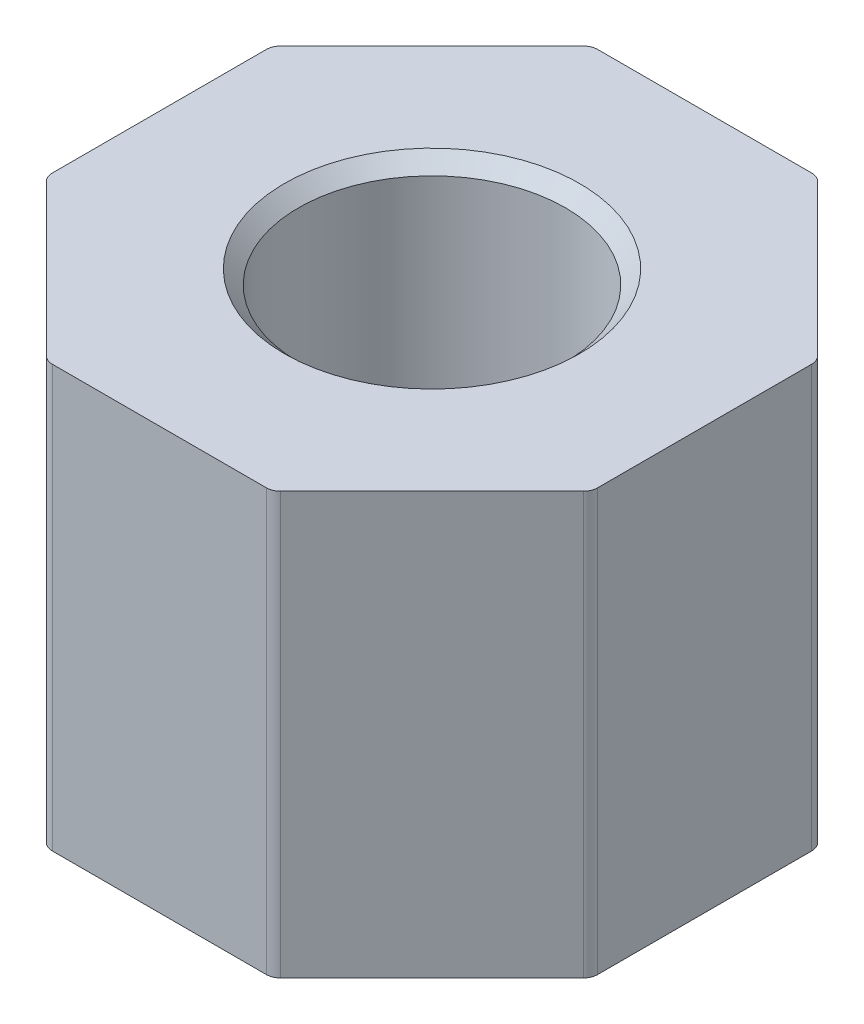
ISO-10303-21;
HEADER;
FILE_DESCRIPTION(('STEP AP214'),'2;1');
FILE_NAME('part.step','',(''),(''),'','','');
FILE_SCHEMA(('AUTOMOTIVE_DESIGN { 1 0 10303 214 1 1 1 1 }'));
ENDSEC;
DATA;
#1=APPLICATION_CONTEXT('core data for automotive mechanical design processes');
#2=APPLICATION_PROTOCOL_DEFINITION('international standard','automotive_design',2000,#1);
#3=PRODUCT_CONTEXT('',#1,'mechanical');
#4=PRODUCT('Part','Part','',(#3));
#5=PRODUCT_RELATED_PRODUCT_CATEGORY('part','',(#4));
#6=PRODUCT_DEFINITION_FORMATION('','',#4);
#7=PRODUCT_DEFINITION_CONTEXT('part definition',#1,'design');
#8=PRODUCT_DEFINITION('design','',#6,#7);
#9=PRODUCT_DEFINITION_SHAPE('','',#8);
#10=(LENGTH_UNIT() NAMED_UNIT(*) SI_UNIT(.MILLI.,.METRE.));
#11=(NAMED_UNIT(*) PLANE_ANGLE_UNIT() SI_UNIT($,.RADIAN.));
#12=(NAMED_UNIT(*) SI_UNIT($,.STERADIAN.) SOLID_ANGLE_UNIT());
#13=UNCERTAINTY_MEASURE_WITH_UNIT(LENGTH_MEASURE(1.E-05),#10,'distance_accuracy_value','');
#14=(GEOMETRIC_REPRESENTATION_CONTEXT(3) GLOBAL_UNCERTAINTY_ASSIGNED_CONTEXT((#13)) GLOBAL_UNIT_ASSIGNED_CONTEXT((#10,
#11,#12)) REPRESENTATION_CONTEXT('',''));
#15=CARTESIAN_POINT('',(0.,0.,0.));
#16=DIRECTION('',(0.,0.,1.));
#17=DIRECTION('',(1.,0.,0.));
#18=AXIS2_PLACEMENT_3D('',#15,#16,#17);
#19=CARTESIAN_POINT('',(19.401470182737,30.,-8.03635207966689));
#20=DIRECTION('',(-0.707106781186547,0.,0.707106781186548));
#21=DIRECTION('',(0.707106781186548,0.,0.707106781186547));
#22=AXIS2_PLACEMENT_3D('',#19,#20,#21);
#23=PLANE('',#22);
#24=DIRECTION('',(-0.707106781186548,0.,-0.707106781186547));
#25=VECTOR('',#24,1.);
#26=CARTESIAN_POINT('',(19.401470182737,30.,-8.03635207966689));
#27=LINE('',#26,#25);
#28=CARTESIAN_POINT('',(19.1085769639236,30.,-8.32924529848034));
#29=VERTEX_POINT('',#28);
#30=CARTESIAN_POINT('',(8.32924529848034,30.,-19.1085769639236));
#31=VERTEX_POINT('',#30);
#32=EDGE_CURVE('E201',#29,#31,#27,.T.);
#33=ORIENTED_EDGE('',*,*,#32,.F.);
#34=DIRECTION('',(0.,-1.,0.));
#35=VECTOR('',#34,1.);
#36=CARTESIAN_POINT('',(19.1085769639236,30.,-8.32924529848034));
#37=LINE('',#36,#35);
#38=CARTESIAN_POINT('',(19.1085769639236,0.,-8.32924529848034));
#39=VERTEX_POINT('',#38);
#40=EDGE_CURVE('E291',#29,#39,#37,.T.);
#41=ORIENTED_EDGE('',*,*,#40,.T.);
#42=DIRECTION('',(-0.707106781186548,0.,-0.707106781186547));
#43=VECTOR('',#42,1.);
#44=CARTESIAN_POINT('',(19.401470182737,0.,-8.03635207966689));
#45=LINE('',#44,#43);
#46=CARTESIAN_POINT('',(8.32924529848034,0.,-19.1085769639236));
#47=VERTEX_POINT('',#46);
#48=EDGE_CURVE('E330',#39,#47,#45,.T.);
#49=ORIENTED_EDGE('',*,*,#48,.T.);
#50=DIRECTION('',(0.,-1.,0.));
#51=VECTOR('',#50,1.);
#52=CARTESIAN_POINT('',(8.32924529848034,30.,-19.1085769639236));
#53=LINE('',#52,#51);
#54=EDGE_CURVE('E288',#47,#31,#53,.F.);
#55=ORIENTED_EDGE('',*,*,#54,.T.);
#56=EDGE_LOOP('',(#33,#41,#49,#55));
#57=FACE_BOUND('',#56,.T.);
#58=ADVANCED_FACE('F38',(#57),#23,.F.);
#59=CARTESIAN_POINT('',(8.03635207966689,30.,-19.401470182737));
#60=DIRECTION('',(0.,0.,1.));
#61=DIRECTION('',(1.,0.,0.));
#62=AXIS2_PLACEMENT_3D('',#59,#60,#61);
#63=PLANE('',#62);
#64=DIRECTION('',(-1.,0.,0.));
#65=VECTOR('',#64,1.);
#66=CARTESIAN_POINT('',(8.03635207966689,30.,-19.401470182737));
#67=LINE('',#66,#65);
#68=CARTESIAN_POINT('',(7.62213851729379,30.,-19.401470182737));
#69=VERTEX_POINT('',#68);
#70=CARTESIAN_POINT('',(-7.6221385172938,30.,-19.401470182737));
#71=VERTEX_POINT('',#70);
#72=EDGE_CURVE('E320',#69,#71,#67,.T.);
#73=ORIENTED_EDGE('',*,*,#72,.F.);
#74=DIRECTION('',(0.,-1.,0.));
#75=VECTOR('',#74,1.);
#76=CARTESIAN_POINT('',(7.62213851729379,30.,-19.401470182737));
#77=LINE('',#76,#75);
#78=CARTESIAN_POINT('',(7.62213851729379,0.,-19.401470182737));
#79=VERTEX_POINT('',#78);
#80=EDGE_CURVE('E298',#69,#79,#77,.T.);
#81=ORIENTED_EDGE('',*,*,#80,.T.);
#82=DIRECTION('',(-1.,0.,0.));
#83=VECTOR('',#82,1.);
#84=CARTESIAN_POINT('',(8.03635207966689,0.,-19.401470182737));
#85=LINE('',#84,#83);
#86=CARTESIAN_POINT('',(-7.6221385172938,0.,-19.401470182737));
#87=VERTEX_POINT('',#86);
#88=EDGE_CURVE('E328',#79,#87,#85,.T.);
#89=ORIENTED_EDGE('',*,*,#88,.T.);
#90=DIRECTION('',(0.,-1.,0.));
#91=VECTOR('',#90,1.);
#92=CARTESIAN_POINT('',(-7.6221385172938,30.,-19.401470182737));
#93=LINE('',#92,#91);
#94=EDGE_CURVE('E295',#87,#71,#93,.F.);
#95=ORIENTED_EDGE('',*,*,#94,.T.);
#96=EDGE_LOOP('',(#73,#81,#89,#95));
#97=FACE_BOUND('',#96,.T.);
#98=ADVANCED_FACE('F364',(#97),#63,.F.);
#99=CARTESIAN_POINT('',(-8.03635207966689,30.,-19.401470182737));
#100=DIRECTION('',(0.707106781186548,0.,0.707106781186547));
#101=DIRECTION('',(0.707106781186547,0.,-0.707106781186548));
#102=AXIS2_PLACEMENT_3D('',#99,#100,#101);
#103=PLANE('',#102);
#104=DIRECTION('',(-0.707106781186548,0.,0.707106781186548));
#105=VECTOR('',#104,1.);
#106=CARTESIAN_POINT('',(-8.03635207966689,30.,-19.401470182737));
#107=LINE('',#106,#105);
#108=CARTESIAN_POINT('',(-8.32924529848034,30.,-19.1085769639236));
#109=VERTEX_POINT('',#108);
#110=CARTESIAN_POINT('',(-19.1085769639236,30.,-8.32924529848033));
#111=VERTEX_POINT('',#110);
#112=EDGE_CURVE('E308',#109,#111,#107,.T.);
#113=ORIENTED_EDGE('',*,*,#112,.F.);
#114=DIRECTION('',(0.,-1.,0.));
#115=VECTOR('',#114,1.);
#116=CARTESIAN_POINT('',(-8.32924529848034,30.,-19.1085769639236));
#117=LINE('',#116,#115);
#118=CARTESIAN_POINT('',(-8.32924529848034,0.,-19.1085769639236));
#119=VERTEX_POINT('',#118);
#120=EDGE_CURVE('E11',#109,#119,#117,.T.);
#121=ORIENTED_EDGE('',*,*,#120,.T.);
#122=DIRECTION('',(-0.707106781186548,0.,0.707106781186548));
#123=VECTOR('',#122,1.);
#124=CARTESIAN_POINT('',(-8.03635207966689,0.,-19.401470182737));
#125=LINE('',#124,#123);
#126=CARTESIAN_POINT('',(-19.1085769639236,0.,-8.32924529848033));
#127=VERTEX_POINT('',#126);
#128=EDGE_CURVE('E191',#119,#127,#125,.T.);
#129=ORIENTED_EDGE('',*,*,#128,.T.);
#130=DIRECTION('',(0.,-1.,0.));
#131=VECTOR('',#130,1.);
#132=CARTESIAN_POINT('',(-19.1085769639236,30.,-8.32924529848034));
#133=LINE('',#132,#131);
#134=EDGE_CURVE('E47',#127,#111,#133,.F.);
#135=ORIENTED_EDGE('',*,*,#134,.T.);
#136=EDGE_LOOP('',(#113,#121,#129,#135));
#137=FACE_BOUND('',#136,.T.);
#138=ADVANCED_FACE('F307',(#137),#103,.F.);
#139=CARTESIAN_POINT('',(-19.401470182737,30.,-8.03635207966688));
#140=DIRECTION('',(1.,0.,0.));
#141=DIRECTION('',(0.,0.,-1.));
#142=AXIS2_PLACEMENT_3D('',#139,#140,#141);
#143=PLANE('',#142);
#144=DIRECTION('',(0.,0.,1.));
#145=VECTOR('',#144,1.);
#146=CARTESIAN_POINT('',(-19.401470182737,0.,-8.03635207966688));
#147=LINE('',#146,#145);
#148=CARTESIAN_POINT('',(-19.401470182737,0.,-7.62213851729379));
#149=VERTEX_POINT('',#148);
#150=CARTESIAN_POINT('',(-19.401470182737,0.,7.62213851729379));
#151=VERTEX_POINT('',#150);
#152=EDGE_CURVE('E184',#149,#151,#147,.T.);
#153=ORIENTED_EDGE('',*,*,#152,.T.);
#154=DIRECTION('',(0.,-1.,0.));
#155=VECTOR('',#154,1.);
#156=CARTESIAN_POINT('',(-19.401470182737,30.,7.62213851729379));
#157=LINE('',#156,#155);
#158=CARTESIAN_POINT('',(-19.401470182737,30.,7.62213851729379));
#159=VERTEX_POINT('',#158);
#160=EDGE_CURVE('E159',#151,#159,#157,.F.);
#161=ORIENTED_EDGE('',*,*,#160,.T.);
#162=DIRECTION('',(0.,0.,1.));
#163=VECTOR('',#162,1.);
#164=CARTESIAN_POINT('',(-19.401470182737,30.,-8.03635207966688));
#165=LINE('',#164,#163);
#166=CARTESIAN_POINT('',(-19.401470182737,30.,-7.62213851729379));
#167=VERTEX_POINT('',#166);
#168=EDGE_CURVE('E319',#167,#159,#165,.T.);
#169=ORIENTED_EDGE('',*,*,#168,.F.);
#170=DIRECTION('',(0.,-1.,0.));
#171=VECTOR('',#170,1.);
#172=CARTESIAN_POINT('',(-19.401470182737,30.,-7.62213851729379));
#173=LINE('',#172,#171);
#174=EDGE_CURVE('E165',#167,#149,#173,.T.);
#175=ORIENTED_EDGE('',*,*,#174,.T.);
#176=EDGE_LOOP('',(#153,#161,#169,#175));
#177=FACE_BOUND('',#176,.T.);
#178=ADVANCED_FACE('F324',(#177),#143,.F.);
#179=CARTESIAN_POINT('',(-19.401470182737,30.,8.03635207966689));
#180=DIRECTION('',(0.707106781186547,0.,-0.707106781186548));
#181=DIRECTION('',(-0.707106781186548,0.,-0.707106781186547));
#182=AXIS2_PLACEMENT_3D('',#179,#180,#181);
#183=PLANE('',#182);
#184=DIRECTION('',(0.707106781186548,0.,0.707106781186547));
#185=VECTOR('',#184,1.);
#186=CARTESIAN_POINT('',(-19.401470182737,30.,8.03635207966689));
#187=LINE('',#186,#185);
#188=CARTESIAN_POINT('',(-19.1085769639236,30.,8.32924529848034));
#189=VERTEX_POINT('',#188);
#190=CARTESIAN_POINT('',(-8.32924529848033,30.,19.1085769639236));
#191=VERTEX_POINT('',#190);
#192=EDGE_CURVE('E175',#189,#191,#187,.T.);
#193=ORIENTED_EDGE('',*,*,#192,.F.);
#194=DIRECTION('',(0.,-1.,0.));
#195=VECTOR('',#194,1.);
#196=CARTESIAN_POINT('',(-19.1085769639236,30.,8.32924529848034));
#197=LINE('',#196,#195);
#198=CARTESIAN_POINT('',(-19.1085769639236,0.,8.32924529848034));
#199=VERTEX_POINT('',#198);
#200=EDGE_CURVE('E158',#189,#199,#197,.T.);
#201=ORIENTED_EDGE('',*,*,#200,.T.);
#202=DIRECTION('',(0.707106781186548,0.,0.707106781186547));
#203=VECTOR('',#202,1.);
#204=CARTESIAN_POINT('',(-19.401470182737,0.,8.03635207966689));
#205=LINE('',#204,#203);
#206=CARTESIAN_POINT('',(-8.32924529848033,0.,19.1085769639236));
#207=VERTEX_POINT('',#206);
#208=EDGE_CURVE('E172',#199,#207,#205,.T.);
#209=ORIENTED_EDGE('',*,*,#208,.T.);
#210=DIRECTION('',(0.,-1.,0.));
#211=VECTOR('',#210,1.);
#212=CARTESIAN_POINT('',(-8.32924529848033,30.,19.1085769639236));
#213=LINE('',#212,#211);
#214=EDGE_CURVE('E178',#207,#191,#213,.F.);
#215=ORIENTED_EDGE('',*,*,#214,.T.);
#216=EDGE_LOOP('',(#193,#201,#209,#215));
#217=FACE_BOUND('',#216,.T.);
#218=ADVANCED_FACE('F171',(#217),#183,.F.);
#219=CARTESIAN_POINT('',(-8.03635207966688,30.,19.401470182737));
#220=DIRECTION('',(0.,0.,-1.));
#221=DIRECTION('',(-1.,0.,0.));
#222=AXIS2_PLACEMENT_3D('',#219,#220,#221);
#223=PLANE('',#222);
#224=DIRECTION('',(1.,0.,0.));
#225=VECTOR('',#224,1.);
#226=CARTESIAN_POINT('',(-8.03635207966688,30.,19.401470182737));
#227=LINE('',#226,#225);
#228=CARTESIAN_POINT('',(-7.62213851729378,30.,19.401470182737));
#229=VERTEX_POINT('',#228);
#230=CARTESIAN_POINT('',(7.6221385172938,30.,19.401470182737));
#231=VERTEX_POINT('',#230);
#232=EDGE_CURVE('E341',#229,#231,#227,.T.);
#233=ORIENTED_EDGE('',*,*,#232,.F.);
#234=DIRECTION('',(0.,-1.,0.));
#235=VECTOR('',#234,1.);
#236=CARTESIAN_POINT('',(-7.62213851729378,30.,19.401470182737));
#237=LINE('',#236,#235);
#238=CARTESIAN_POINT('',(-7.62213851729378,0.,19.401470182737));
#239=VERTEX_POINT('',#238);
#240=EDGE_CURVE('E271',#229,#239,#237,.T.);
#241=ORIENTED_EDGE('',*,*,#240,.T.);
#242=DIRECTION('',(1.,0.,0.));
#243=VECTOR('',#242,1.);
#244=CARTESIAN_POINT('',(-8.03635207966688,0.,19.401470182737));
#245=LINE('',#244,#243);
#246=CARTESIAN_POINT('',(7.6221385172938,0.,19.401470182737));
#247=VERTEX_POINT('',#246);
#248=EDGE_CURVE('E183',#239,#247,#245,.T.);
#249=ORIENTED_EDGE('',*,*,#248,.T.);
#250=DIRECTION('',(0.,-1.,0.));
#251=VECTOR('',#250,1.);
#252=CARTESIAN_POINT('',(7.6221385172938,30.,19.401470182737));
#253=LINE('',#252,#251);
#254=EDGE_CURVE('E268',#247,#231,#253,.F.);
#255=ORIENTED_EDGE('',*,*,#254,.T.);
#256=EDGE_LOOP('',(#233,#241,#249,#255));
#257=FACE_BOUND('',#256,.T.);
#258=ADVANCED_FACE('F386',(#257),#223,.F.);
#259=CARTESIAN_POINT('',(8.03635207966689,30.,19.401470182737));
#260=DIRECTION('',(-0.707106781186548,0.,-0.707106781186547));
#261=DIRECTION('',(-0.707106781186547,0.,0.707106781186548));
#262=AXIS2_PLACEMENT_3D('',#259,#260,#261);
#263=PLANE('',#262);
#264=DIRECTION('',(0.707106781186547,0.,-0.707106781186548));
#265=VECTOR('',#264,1.);
#266=CARTESIAN_POINT('',(8.03635207966689,30.,19.401470182737));
#267=LINE('',#266,#265);
#268=CARTESIAN_POINT('',(8.32924529848034,30.,19.1085769639236));
#269=VERTEX_POINT('',#268);
#270=CARTESIAN_POINT('',(19.1085769639236,30.,8.32924529848034));
#271=VERTEX_POINT('',#270);
#272=EDGE_CURVE('E338',#269,#271,#267,.T.);
#273=ORIENTED_EDGE('',*,*,#272,.F.);
#274=DIRECTION('',(0.,-1.,0.));
#275=VECTOR('',#274,1.);
#276=CARTESIAN_POINT('',(8.32924529848034,30.,19.1085769639236));
#277=LINE('',#276,#275);
#278=CARTESIAN_POINT('',(8.32924529848034,0.,19.1085769639236));
#279=VERTEX_POINT('',#278);
#280=EDGE_CURVE('E278',#269,#279,#277,.T.);
#281=ORIENTED_EDGE('',*,*,#280,.T.);
#282=DIRECTION('',(0.707106781186547,0.,-0.707106781186548));
#283=VECTOR('',#282,1.);
#284=CARTESIAN_POINT('',(8.03635207966689,0.,19.401470182737));
#285=LINE('',#284,#283);
#286=CARTESIAN_POINT('',(19.1085769639236,0.,8.32924529848034));
#287=VERTEX_POINT('',#286);
#288=EDGE_CURVE('E189',#279,#287,#285,.T.);
#289=ORIENTED_EDGE('',*,*,#288,.T.);
#290=DIRECTION('',(0.,-1.,0.));
#291=VECTOR('',#290,1.);
#292=CARTESIAN_POINT('',(19.1085769639236,30.,8.32924529848034));
#293=LINE('',#292,#291);
#294=EDGE_CURVE('E275',#287,#271,#293,.F.);
#295=ORIENTED_EDGE('',*,*,#294,.T.);
#296=EDGE_LOOP('',(#273,#281,#289,#295));
#297=FACE_BOUND('',#296,.T.);
#298=ADVANCED_FACE('F378',(#297),#263,.F.);
#299=CARTESIAN_POINT('',(19.401470182737,30.,8.03635207966689));
#300=DIRECTION('',(-1.,0.,0.));
#301=DIRECTION('',(0.,0.,1.));
#302=AXIS2_PLACEMENT_3D('',#299,#300,#301);
#303=PLANE('',#302);
#304=DIRECTION('',(0.,0.,-1.));
#305=VECTOR('',#304,1.);
#306=CARTESIAN_POINT('',(19.401470182737,30.,8.03635207966689));
#307=LINE('',#306,#305);
#308=CARTESIAN_POINT('',(19.401470182737,30.,7.62213851729379));
#309=VERTEX_POINT('',#308);
#310=CARTESIAN_POINT('',(19.401470182737,30.,-7.62213851729379));
#311=VERTEX_POINT('',#310);
#312=EDGE_CURVE('E207',#309,#311,#307,.T.);
#313=ORIENTED_EDGE('',*,*,#312,.F.);
#314=DIRECTION('',(0.,-1.,0.));
#315=VECTOR('',#314,1.);
#316=CARTESIAN_POINT('',(19.401470182737,30.,7.62213851729379));
#317=LINE('',#316,#315);
#318=CARTESIAN_POINT('',(19.401470182737,0.,7.62213851729379));
#319=VERTEX_POINT('',#318);
#320=EDGE_CURVE('E284',#309,#319,#317,.T.);
#321=ORIENTED_EDGE('',*,*,#320,.T.);
#322=DIRECTION('',(0.,0.,-1.));
#323=VECTOR('',#322,1.);
#324=CARTESIAN_POINT('',(19.401470182737,0.,8.03635207966689));
#325=LINE('',#324,#323);
#326=CARTESIAN_POINT('',(19.401470182737,0.,-7.62213851729379));
#327=VERTEX_POINT('',#326);
#328=EDGE_CURVE('E198',#319,#327,#325,.T.);
#329=ORIENTED_EDGE('',*,*,#328,.T.);
#330=DIRECTION('',(0.,-1.,0.));
#331=VECTOR('',#330,1.);
#332=CARTESIAN_POINT('',(19.401470182737,30.,-7.62213851729379));
#333=LINE('',#332,#331);
#334=EDGE_CURVE('E54',#327,#311,#333,.F.);
#335=ORIENTED_EDGE('',*,*,#334,.T.);
#336=EDGE_LOOP('',(#313,#321,#329,#335));
#337=FACE_BOUND('',#336,.T.);
#338=ADVANCED_FACE('F370',(#337),#303,.F.);
#339=CARTESIAN_POINT('',(0.,30.,0.));
#340=DIRECTION('',(0.,1.,0.));
#341=DIRECTION('',(0.,0.,1.));
#342=AXIS2_PLACEMENT_3D('',#339,#340,#341);
#343=PLANE('',#342);
#344=CARTESIAN_POINT('',(0.,30.,0.));
#345=DIRECTION('',(0.,1.,0.));
#346=DIRECTION('',(0.,0.,1.));
#347=AXIS2_PLACEMENT_3D('',#344,#345,#346);
#348=CIRCLE('',#347,10.5);
#349=CARTESIAN_POINT('',(0.,30.,10.5));
#350=VERTEX_POINT('',#349);
#351=EDGE_CURVE('E215',#350,#350,#348,.F.);
#352=ORIENTED_EDGE('',*,*,#351,.T.);
#353=EDGE_LOOP('',(#352));
#354=FACE_BOUND('',#353,.T.);
#355=ORIENTED_EDGE('',*,*,#168,.T.);
#356=CARTESIAN_POINT('',(-18.401470182737,30.,7.62213851729379));
#357=DIRECTION('',(0.,1.,0.));
#358=DIRECTION('',(0.,0.,1.));
#359=AXIS2_PLACEMENT_3D('',#356,#357,#358);
#360=CIRCLE('',#359,1.);
#361=EDGE_CURVE('E265',#159,#189,#360,.T.);
#362=ORIENTED_EDGE('',*,*,#361,.T.);
#363=ORIENTED_EDGE('',*,*,#192,.T.);
#364=CARTESIAN_POINT('',(-7.62213851729378,30.,18.401470182737));
#365=DIRECTION('',(0.,1.,0.));
#366=DIRECTION('',(0.,0.,1.));
#367=AXIS2_PLACEMENT_3D('',#364,#365,#366);
#368=CIRCLE('',#367,1.);
#369=EDGE_CURVE('E262',#191,#229,#368,.T.);
#370=ORIENTED_EDGE('',*,*,#369,.T.);
#371=ORIENTED_EDGE('',*,*,#232,.T.);
#372=CARTESIAN_POINT('',(7.6221385172938,30.,18.401470182737));
#373=DIRECTION('',(0.,1.,0.));
#374=DIRECTION('',(0.,0.,1.));
#375=AXIS2_PLACEMENT_3D('',#372,#373,#374);
#376=CIRCLE('',#375,1.);
#377=EDGE_CURVE('E259',#231,#269,#376,.T.);
#378=ORIENTED_EDGE('',*,*,#377,.T.);
#379=ORIENTED_EDGE('',*,*,#272,.T.);
#380=CARTESIAN_POINT('',(18.401470182737,30.,7.62213851729379));
#381=DIRECTION('',(0.,1.,0.));
#382=DIRECTION('',(0.,0.,1.));
#383=AXIS2_PLACEMENT_3D('',#380,#381,#382);
#384=CIRCLE('',#383,1.);
#385=EDGE_CURVE('E61',#271,#309,#384,.T.);
#386=ORIENTED_EDGE('',*,*,#385,.T.);
#387=ORIENTED_EDGE('',*,*,#312,.T.);
#388=CARTESIAN_POINT('',(18.401470182737,30.,-7.6221385172938));
#389=DIRECTION('',(0.,1.,0.));
#390=DIRECTION('',(0.,0.,1.));
#391=AXIS2_PLACEMENT_3D('',#388,#389,#390);
#392=CIRCLE('',#391,1.);
#393=EDGE_CURVE('E254',#311,#29,#392,.T.);
#394=ORIENTED_EDGE('',*,*,#393,.T.);
#395=ORIENTED_EDGE('',*,*,#32,.T.);
#396=CARTESIAN_POINT('',(7.62213851729379,30.,-18.401470182737));
#397=DIRECTION('',(0.,1.,0.));
#398=DIRECTION('',(0.,0.,1.));
#399=AXIS2_PLACEMENT_3D('',#396,#397,#398);
#400=CIRCLE('',#399,1.);
#401=EDGE_CURVE('E251',#31,#69,#400,.T.);
#402=ORIENTED_EDGE('',*,*,#401,.T.);
#403=ORIENTED_EDGE('',*,*,#72,.T.);
#404=CARTESIAN_POINT('',(-7.6221385172938,30.,-18.401470182737));
#405=DIRECTION('',(0.,1.,0.));
#406=DIRECTION('',(0.,0.,1.));
#407=AXIS2_PLACEMENT_3D('',#404,#405,#406);
#408=CIRCLE('',#407,1.);
#409=EDGE_CURVE('E248',#71,#109,#408,.T.);
#410=ORIENTED_EDGE('',*,*,#409,.T.);
#411=ORIENTED_EDGE('',*,*,#112,.T.);
#412=CARTESIAN_POINT('',(-18.401470182737,30.,-7.62213851729379));
#413=DIRECTION('',(0.,1.,0.));
#414=DIRECTION('',(0.,0.,1.));
#415=AXIS2_PLACEMENT_3D('',#412,#413,#414);
#416=CIRCLE('',#415,1.);
#417=EDGE_CURVE('E245',#111,#167,#416,.T.);
#418=ORIENTED_EDGE('',*,*,#417,.T.);
#419=EDGE_LOOP('',(#355,#362,#363,#370,#371,#378,#379,#386,#387,#394,#395,#402,#403,#410,#411,#418));
#420=FACE_BOUND('',#419,.T.);
#421=ADVANCED_FACE('F314',(#354,#420),#343,.T.);
#422=CARTESIAN_POINT('',(0.,0.,0.));
#423=DIRECTION('',(0.,1.,0.));
#424=DIRECTION('',(0.,0.,1.));
#425=AXIS2_PLACEMENT_3D('',#422,#423,#424);
#426=PLANE('',#425);
#427=CARTESIAN_POINT('',(0.,0.,0.));
#428=DIRECTION('',(0.,1.,0.));
#429=DIRECTION('',(0.,0.,1.));
#430=AXIS2_PLACEMENT_3D('',#427,#428,#429);
#431=CIRCLE('',#430,10.5);
#432=CARTESIAN_POINT('',(0.,0.,10.5));
#433=VERTEX_POINT('',#432);
#434=EDGE_CURVE('E202',#433,#433,#431,.T.);
#435=ORIENTED_EDGE('',*,*,#434,.T.);
#436=EDGE_LOOP('',(#435));
#437=FACE_BOUND('',#436,.T.);
#438=ORIENTED_EDGE('',*,*,#208,.F.);
#439=CARTESIAN_POINT('',(-18.401470182737,0.,7.62213851729379));
#440=DIRECTION('',(0.,1.,0.));
#441=DIRECTION('',(0.,0.,1.));
#442=AXIS2_PLACEMENT_3D('',#439,#440,#441);
#443=CIRCLE('',#442,1.);
#444=EDGE_CURVE('E154',#199,#151,#443,.F.);
#445=ORIENTED_EDGE('',*,*,#444,.T.);
#446=ORIENTED_EDGE('',*,*,#152,.F.);
#447=CARTESIAN_POINT('',(-18.401470182737,0.,-7.62213851729379));
#448=DIRECTION('',(0.,1.,0.));
#449=DIRECTION('',(0.,0.,1.));
#450=AXIS2_PLACEMENT_3D('',#447,#448,#449);
#451=CIRCLE('',#450,1.);
#452=EDGE_CURVE('E177',#149,#127,#451,.F.);
#453=ORIENTED_EDGE('',*,*,#452,.T.);
#454=ORIENTED_EDGE('',*,*,#128,.F.);
#455=CARTESIAN_POINT('',(-7.6221385172938,0.,-18.401470182737));
#456=DIRECTION('',(0.,1.,0.));
#457=DIRECTION('',(0.,0.,1.));
#458=AXIS2_PLACEMENT_3D('',#455,#456,#457);
#459=CIRCLE('',#458,1.);
#460=EDGE_CURVE('E223',#119,#87,#459,.F.);
#461=ORIENTED_EDGE('',*,*,#460,.T.);
#462=ORIENTED_EDGE('',*,*,#88,.F.);
#463=CARTESIAN_POINT('',(7.62213851729379,0.,-18.401470182737));
#464=DIRECTION('',(0.,1.,0.));
#465=DIRECTION('',(0.,0.,1.));
#466=AXIS2_PLACEMENT_3D('',#463,#464,#465);
#467=CIRCLE('',#466,1.);
#468=EDGE_CURVE('E226',#79,#47,#467,.F.);
#469=ORIENTED_EDGE('',*,*,#468,.T.);
#470=ORIENTED_EDGE('',*,*,#48,.F.);
#471=CARTESIAN_POINT('',(18.401470182737,0.,-7.6221385172938));
#472=DIRECTION('',(0.,1.,0.));
#473=DIRECTION('',(0.,0.,1.));
#474=AXIS2_PLACEMENT_3D('',#471,#472,#473);
#475=CIRCLE('',#474,1.);
#476=EDGE_CURVE('E229',#39,#327,#475,.F.);
#477=ORIENTED_EDGE('',*,*,#476,.T.);
#478=ORIENTED_EDGE('',*,*,#328,.F.);
#479=CARTESIAN_POINT('',(18.401470182737,0.,7.62213851729379));
#480=DIRECTION('',(0.,1.,0.));
#481=DIRECTION('',(0.,0.,1.));
#482=AXIS2_PLACEMENT_3D('',#479,#480,#481);
#483=CIRCLE('',#482,1.);
#484=EDGE_CURVE('E232',#319,#287,#483,.F.);
#485=ORIENTED_EDGE('',*,*,#484,.T.);
#486=ORIENTED_EDGE('',*,*,#288,.F.);
#487=CARTESIAN_POINT('',(7.6221385172938,0.,18.401470182737));
#488=DIRECTION('',(0.,1.,0.));
#489=DIRECTION('',(0.,0.,1.));
#490=AXIS2_PLACEMENT_3D('',#487,#488,#489);
#491=CIRCLE('',#490,1.);
#492=EDGE_CURVE('E235',#279,#247,#491,.F.);
#493=ORIENTED_EDGE('',*,*,#492,.T.);
#494=ORIENTED_EDGE('',*,*,#248,.F.);
#495=CARTESIAN_POINT('',(-7.62213851729378,0.,18.401470182737));
#496=DIRECTION('',(0.,1.,0.));
#497=DIRECTION('',(0.,0.,1.));
#498=AXIS2_PLACEMENT_3D('',#495,#496,#497);
#499=CIRCLE('',#498,1.);
#500=EDGE_CURVE('E166',#239,#207,#499,.F.);
#501=ORIENTED_EDGE('',*,*,#500,.T.);
#502=EDGE_LOOP('',(#438,#445,#446,#453,#454,#461,#462,#469,#470,#477,#478,#485,#486,#493,#494,#501));
#503=FACE_BOUND('',#502,.T.);
#504=ADVANCED_FACE('F180',(#437,#503),#426,.F.);
#505=CARTESIAN_POINT('',(0.,0.,0.));
#506=DIRECTION('',(0.,1.,0.));
#507=DIRECTION('',(0.,0.,1.));
#508=AXIS2_PLACEMENT_3D('',#505,#506,#507);
#509=CYLINDRICAL_SURFACE('',#508,9.5);
#510=CARTESIAN_POINT('',(0.,0.999999999999997,0.));
#511=DIRECTION('',(0.,1.,0.));
#512=DIRECTION('',(0.,0.,1.));
#513=AXIS2_PLACEMENT_3D('',#510,#511,#512);
#514=CIRCLE('',#513,9.5);
#515=CARTESIAN_POINT('',(0.,0.999999999999997,9.5));
#516=VERTEX_POINT('',#515);
#517=EDGE_CURVE('E211',#516,#516,#514,.F.);
#518=ORIENTED_EDGE('',*,*,#517,.T.);
#519=EDGE_LOOP('',(#518));
#520=FACE_BOUND('',#519,.T.);
#521=CARTESIAN_POINT('',(0.,29.,0.));
#522=DIRECTION('',(0.,1.,0.));
#523=DIRECTION('',(0.,0.,1.));
#524=AXIS2_PLACEMENT_3D('',#521,#522,#523);
#525=CIRCLE('',#524,9.5);
#526=CARTESIAN_POINT('',(0.,29.,9.5));
#527=VERTEX_POINT('',#526);
#528=EDGE_CURVE('E206',#527,#527,#525,.T.);
#529=ORIENTED_EDGE('',*,*,#528,.T.);
#530=EDGE_LOOP('',(#529));
#531=FACE_BOUND('',#530,.T.);
#532=ADVANCED_FACE('F412',(#520,#531),#509,.F.);
#533=CARTESIAN_POINT('',(0.,0.,0.));
#534=DIRECTION('',(0.,-1.,0.));
#535=DIRECTION('',(0.,0.,-1.));
#536=AXIS2_PLACEMENT_3D('',#533,#534,#535);
#537=CONICAL_SURFACE('',#536,10.5,0.785398163397447);
#538=ORIENTED_EDGE('',*,*,#517,.F.);
#539=EDGE_LOOP('',(#538));
#540=FACE_BOUND('',#539,.T.);
#541=ORIENTED_EDGE('',*,*,#434,.F.);
#542=EDGE_LOOP('',(#541));
#543=FACE_BOUND('',#542,.T.);
#544=ADVANCED_FACE('F409',(#540,#543),#537,.F.);
#545=CARTESIAN_POINT('',(0.,29.,0.));
#546=DIRECTION('',(0.,1.,0.));
#547=DIRECTION('',(0.,0.,1.));
#548=AXIS2_PLACEMENT_3D('',#545,#546,#547);
#549=CONICAL_SURFACE('',#548,9.5,0.785398163397449);
#550=ORIENTED_EDGE('',*,*,#351,.F.);
#551=EDGE_LOOP('',(#550));
#552=FACE_BOUND('',#551,.T.);
#553=ORIENTED_EDGE('',*,*,#528,.F.);
#554=EDGE_LOOP('',(#553));
#555=FACE_BOUND('',#554,.T.);
#556=ADVANCED_FACE('F398',(#552,#555),#549,.F.);
#557=CARTESIAN_POINT('',(-18.401470182737,30.,7.62213851729379));
#558=DIRECTION('',(0.,-1.,0.));
#559=DIRECTION('',(0.,0.,-1.));
#560=AXIS2_PLACEMENT_3D('',#557,#558,#559);
#561=CYLINDRICAL_SURFACE('',#560,1.);
#562=ORIENTED_EDGE('',*,*,#361,.F.);
#563=ORIENTED_EDGE('',*,*,#160,.F.);
#564=ORIENTED_EDGE('',*,*,#444,.F.);
#565=ORIENTED_EDGE('',*,*,#200,.F.);
#566=EDGE_LOOP('',(#562,#563,#564,#565));
#567=FACE_BOUND('',#566,.T.);
#568=ADVANCED_FACE('F157',(#567),#561,.T.);
#569=CARTESIAN_POINT('',(-7.62213851729378,30.,18.401470182737));
#570=DIRECTION('',(0.,-1.,0.));
#571=DIRECTION('',(0.,0.,-1.));
#572=AXIS2_PLACEMENT_3D('',#569,#570,#571);
#573=CYLINDRICAL_SURFACE('',#572,1.);
#574=ORIENTED_EDGE('',*,*,#369,.F.);
#575=ORIENTED_EDGE('',*,*,#214,.F.);
#576=ORIENTED_EDGE('',*,*,#500,.F.);
#577=ORIENTED_EDGE('',*,*,#240,.F.);
#578=EDGE_LOOP('',(#574,#575,#576,#577));
#579=FACE_BOUND('',#578,.T.);
#580=ADVANCED_FACE('F390',(#579),#573,.T.);
#581=CARTESIAN_POINT('',(7.6221385172938,30.,18.401470182737));
#582=DIRECTION('',(0.,-1.,0.));
#583=DIRECTION('',(0.,0.,-1.));
#584=AXIS2_PLACEMENT_3D('',#581,#582,#583);
#585=CYLINDRICAL_SURFACE('',#584,1.);
#586=ORIENTED_EDGE('',*,*,#377,.F.);
#587=ORIENTED_EDGE('',*,*,#254,.F.);
#588=ORIENTED_EDGE('',*,*,#492,.F.);
#589=ORIENTED_EDGE('',*,*,#280,.F.);
#590=EDGE_LOOP('',(#586,#587,#588,#589));
#591=FACE_BOUND('',#590,.T.);
#592=ADVANCED_FACE('F382',(#591),#585,.T.);
#593=CARTESIAN_POINT('',(18.401470182737,30.,7.62213851729379));
#594=DIRECTION('',(0.,-1.,0.));
#595=DIRECTION('',(0.,0.,-1.));
#596=AXIS2_PLACEMENT_3D('',#593,#594,#595);
#597=CYLINDRICAL_SURFACE('',#596,1.);
#598=ORIENTED_EDGE('',*,*,#385,.F.);
#599=ORIENTED_EDGE('',*,*,#294,.F.);
#600=ORIENTED_EDGE('',*,*,#484,.F.);
#601=ORIENTED_EDGE('',*,*,#320,.F.);
#602=EDGE_LOOP('',(#598,#599,#600,#601));
#603=FACE_BOUND('',#602,.T.);
#604=ADVANCED_FACE('F373',(#603),#597,.T.);
#605=CARTESIAN_POINT('',(18.401470182737,30.,-7.6221385172938));
#606=DIRECTION('',(0.,-1.,0.));
#607=DIRECTION('',(0.,0.,-1.));
#608=AXIS2_PLACEMENT_3D('',#605,#606,#607);
#609=CYLINDRICAL_SURFACE('',#608,1.);
#610=ORIENTED_EDGE('',*,*,#393,.F.);
#611=ORIENTED_EDGE('',*,*,#334,.F.);
#612=ORIENTED_EDGE('',*,*,#476,.F.);
#613=ORIENTED_EDGE('',*,*,#40,.F.);
#614=EDGE_LOOP('',(#610,#611,#612,#613));
#615=FACE_BOUND('',#614,.T.);
#616=ADVANCED_FACE('F368',(#615),#609,.T.);
#617=CARTESIAN_POINT('',(7.62213851729379,30.,-18.401470182737));
#618=DIRECTION('',(0.,-1.,0.));
#619=DIRECTION('',(0.,0.,-1.));
#620=AXIS2_PLACEMENT_3D('',#617,#618,#619);
#621=CYLINDRICAL_SURFACE('',#620,1.);
#622=ORIENTED_EDGE('',*,*,#401,.F.);
#623=ORIENTED_EDGE('',*,*,#54,.F.);
#624=ORIENTED_EDGE('',*,*,#468,.F.);
#625=ORIENTED_EDGE('',*,*,#80,.F.);
#626=EDGE_LOOP('',(#622,#623,#624,#625));
#627=FACE_BOUND('',#626,.T.);
#628=ADVANCED_FACE('F362',(#627),#621,.T.);
#629=CARTESIAN_POINT('',(-7.6221385172938,30.,-18.401470182737));
#630=DIRECTION('',(0.,-1.,0.));
#631=DIRECTION('',(0.,0.,-1.));
#632=AXIS2_PLACEMENT_3D('',#629,#630,#631);
#633=CYLINDRICAL_SURFACE('',#632,1.);
#634=ORIENTED_EDGE('',*,*,#409,.F.);
#635=ORIENTED_EDGE('',*,*,#94,.F.);
#636=ORIENTED_EDGE('',*,*,#460,.F.);
#637=ORIENTED_EDGE('',*,*,#120,.F.);
#638=EDGE_LOOP('',(#634,#635,#636,#637));
#639=FACE_BOUND('',#638,.T.);
#640=ADVANCED_FACE('F516',(#639),#633,.T.);
#641=CARTESIAN_POINT('',(-18.401470182737,30.,-7.62213851729379));
#642=DIRECTION('',(0.,-1.,0.));
#643=DIRECTION('',(0.,0.,-1.));
#644=AXIS2_PLACEMENT_3D('',#641,#642,#643);
#645=CYLINDRICAL_SURFACE('',#644,1.);
#646=ORIENTED_EDGE('',*,*,#417,.F.);
#647=ORIENTED_EDGE('',*,*,#134,.F.);
#648=ORIENTED_EDGE('',*,*,#452,.F.);
#649=ORIENTED_EDGE('',*,*,#174,.F.);
#650=EDGE_LOOP('',(#646,#647,#648,#649));
#651=FACE_BOUND('',#650,.T.);
#652=ADVANCED_FACE('F40',(#651),#645,.T.);
#653=CLOSED_SHELL('',(#58,#98,#138,#178,#218,#258,#298,#338,#421,#504,#532,#544,#556,#568,#580,
#592,#604,#616,#628,#640,#652));
#654=MANIFOLD_SOLID_BREP('B2',#653);
#655=ADVANCED_BREP_SHAPE_REPRESENTATION('',(#18,#654),#14);
#656=SHAPE_DEFINITION_REPRESENTATION(#9,#655);
ENDSEC;
END-ISO-10303-21;
